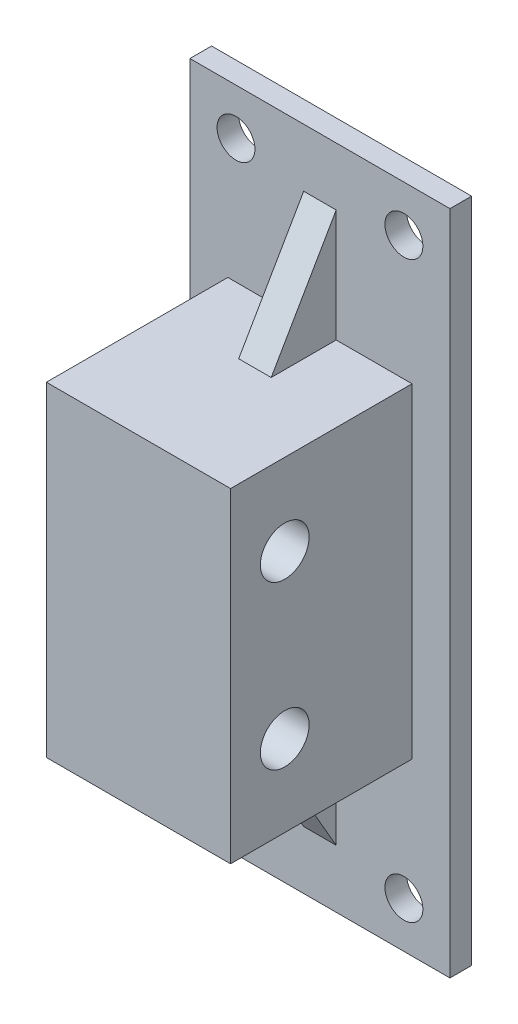
ISO-10303-21;
HEADER;
FILE_DESCRIPTION(('STEP AP214'),'2;1');
FILE_NAME('part.step','',(''),(''),'','','');
FILE_SCHEMA(('AUTOMOTIVE_DESIGN { 1 0 10303 214 1 1 1 1 }'));
ENDSEC;
DATA;
#1=APPLICATION_CONTEXT('core data for automotive mechanical design processes');
#2=APPLICATION_PROTOCOL_DEFINITION('international standard','automotive_design',2000,#1);
#3=PRODUCT_CONTEXT('',#1,'mechanical');
#4=PRODUCT('Part','Part','',(#3));
#5=PRODUCT_RELATED_PRODUCT_CATEGORY('part','',(#4));
#6=PRODUCT_DEFINITION_FORMATION('','',#4);
#7=PRODUCT_DEFINITION_CONTEXT('part definition',#1,'design');
#8=PRODUCT_DEFINITION('design','',#6,#7);
#9=PRODUCT_DEFINITION_SHAPE('','',#8);
#10=(LENGTH_UNIT() NAMED_UNIT(*) SI_UNIT(.MILLI.,.METRE.));
#11=(NAMED_UNIT(*) PLANE_ANGLE_UNIT() SI_UNIT($,.RADIAN.));
#12=(NAMED_UNIT(*) SI_UNIT($,.STERADIAN.) SOLID_ANGLE_UNIT());
#13=UNCERTAINTY_MEASURE_WITH_UNIT(LENGTH_MEASURE(1.E-05),#10,'distance_accuracy_value','');
#14=(GEOMETRIC_REPRESENTATION_CONTEXT(3) GLOBAL_UNCERTAINTY_ASSIGNED_CONTEXT((#13)) GLOBAL_UNIT_ASSIGNED_CONTEXT((#10,
#11,#12)) REPRESENTATION_CONTEXT('',''));
#15=CARTESIAN_POINT('',(0.,0.,0.));
#16=DIRECTION('',(0.,0.,1.));
#17=DIRECTION('',(1.,0.,0.));
#18=AXIS2_PLACEMENT_3D('',#15,#16,#17);
#19=CARTESIAN_POINT('',(0.,0.,2.));
#20=DIRECTION('',(0.,0.,1.));
#21=DIRECTION('',(1.,0.,0.));
#22=AXIS2_PLACEMENT_3D('',#19,#20,#21);
#23=PLANE('',#22);
#24=CARTESIAN_POINT('',(19.75,4.25,2.));
#25=DIRECTION('',(0.,0.,1.));
#26=DIRECTION('',(1.,0.,0.));
#27=AXIS2_PLACEMENT_3D('',#24,#25,#26);
#28=CIRCLE('',#27,1.75);
#29=CARTESIAN_POINT('',(21.5,4.25,2.));
#30=VERTEX_POINT('',#29);
#31=EDGE_CURVE('E471',#30,#30,#28,.T.);
#32=ORIENTED_EDGE('',*,*,#31,.F.);
#33=EDGE_LOOP('',(#32));
#34=FACE_BOUND('',#33,.T.);
#35=CARTESIAN_POINT('',(4.25,4.25,2.));
#36=DIRECTION('',(0.,0.,1.));
#37=DIRECTION('',(1.,0.,0.));
#38=AXIS2_PLACEMENT_3D('',#35,#36,#37);
#39=CIRCLE('',#38,1.75);
#40=CARTESIAN_POINT('',(6.,4.25,2.));
#41=VERTEX_POINT('',#40);
#42=EDGE_CURVE('E473',#41,#41,#39,.T.);
#43=ORIENTED_EDGE('',*,*,#42,.F.);
#44=EDGE_LOOP('',(#43));
#45=FACE_BOUND('',#44,.T.);
#46=CARTESIAN_POINT('',(19.75,57.2499999999997,2.));
#47=DIRECTION('',(0.,0.,1.));
#48=DIRECTION('',(1.,0.,0.));
#49=AXIS2_PLACEMENT_3D('',#46,#47,#48);
#50=CIRCLE('',#49,1.75);
#51=CARTESIAN_POINT('',(21.5,57.2499999999997,2.));
#52=VERTEX_POINT('',#51);
#53=EDGE_CURVE('E479',#52,#52,#50,.T.);
#54=ORIENTED_EDGE('',*,*,#53,.F.);
#55=EDGE_LOOP('',(#54));
#56=FACE_BOUND('',#55,.T.);
#57=CARTESIAN_POINT('',(4.25,57.2499999999997,2.));
#58=DIRECTION('',(0.,0.,1.));
#59=DIRECTION('',(1.,0.,0.));
#60=AXIS2_PLACEMENT_3D('',#57,#58,#59);
#61=CIRCLE('',#60,1.75);
#62=CARTESIAN_POINT('',(6.,57.2499999999997,2.));
#63=VERTEX_POINT('',#62);
#64=EDGE_CURVE('E485',#63,#63,#61,.T.);
#65=ORIENTED_EDGE('',*,*,#64,.F.);
#66=EDGE_LOOP('',(#65));
#67=FACE_BOUND('',#66,.T.);
#68=DIRECTION('',(0.,-1.,0.));
#69=VECTOR('',#68,1.);
#70=CARTESIAN_POINT('',(0.,61.4999999999997,2.));
#71=LINE('',#70,#69);
#72=CARTESIAN_POINT('',(0.,61.4999999999997,2.));
#73=VERTEX_POINT('',#72);
#74=CARTESIAN_POINT('',(0.,0.,2.));
#75=VERTEX_POINT('',#74);
#76=EDGE_CURVE('E218',#73,#75,#71,.T.);
#77=ORIENTED_EDGE('',*,*,#76,.T.);
#78=DIRECTION('',(1.,0.,0.));
#79=VECTOR('',#78,1.);
#80=CARTESIAN_POINT('',(0.,0.,2.));
#81=LINE('',#80,#79);
#82=CARTESIAN_POINT('',(24.,0.,2.));
#83=VERTEX_POINT('',#82);
#84=EDGE_CURVE('E221',#75,#83,#81,.T.);
#85=ORIENTED_EDGE('',*,*,#84,.T.);
#86=DIRECTION('',(0.,1.,0.));
#87=VECTOR('',#86,1.);
#88=CARTESIAN_POINT('',(24.,61.4999999999997,2.));
#89=LINE('',#88,#87);
#90=CARTESIAN_POINT('',(24.,61.4999999999997,2.));
#91=VERTEX_POINT('',#90);
#92=EDGE_CURVE('E224',#83,#91,#89,.T.);
#93=ORIENTED_EDGE('',*,*,#92,.T.);
#94=DIRECTION('',(-1.,0.,0.));
#95=VECTOR('',#94,1.);
#96=CARTESIAN_POINT('',(0.,61.4999999999997,2.));
#97=LINE('',#96,#95);
#98=EDGE_CURVE('E226',#91,#73,#97,.T.);
#99=ORIENTED_EDGE('',*,*,#98,.T.);
#100=EDGE_LOOP('',(#77,#85,#93,#99));
#101=FACE_BOUND('',#100,.T.);
#102=DIRECTION('',(1.,0.,0.));
#103=VECTOR('',#102,1.);
#104=CARTESIAN_POINT('',(3.5,15.7500000000002,2.));
#105=LINE('',#104,#103);
#106=CARTESIAN_POINT('',(13.5,15.7500000000001,2.));
#107=VERTEX_POINT('',#106);
#108=CARTESIAN_POINT('',(20.5,15.7500000000002,2.));
#109=VERTEX_POINT('',#108);
#110=EDGE_CURVE('E199',#107,#109,#105,.T.);
#111=ORIENTED_EDGE('',*,*,#110,.F.);
#112=DIRECTION('',(0.,1.,0.));
#113=VECTOR('',#112,1.);
#114=CARTESIAN_POINT('',(13.5,15.7500000000001,2.));
#115=LINE('',#114,#113);
#116=CARTESIAN_POINT('',(13.5,5.357695154587,2.));
#117=VERTEX_POINT('',#116);
#118=EDGE_CURVE('E143',#117,#107,#115,.T.);
#119=ORIENTED_EDGE('',*,*,#118,.F.);
#120=DIRECTION('',(-1.,0.,0.));
#121=VECTOR('',#120,1.);
#122=CARTESIAN_POINT('',(13.5,5.357695154587,2.));
#123=LINE('',#122,#121);
#124=CARTESIAN_POINT('',(10.5,5.357695154587,2.));
#125=VERTEX_POINT('',#124);
#126=EDGE_CURVE('E140',#117,#125,#123,.T.);
#127=ORIENTED_EDGE('',*,*,#126,.T.);
#128=DIRECTION('',(0.,1.,0.));
#129=VECTOR('',#128,1.);
#130=CARTESIAN_POINT('',(10.5,15.7500000000001,2.));
#131=LINE('',#130,#129);
#132=CARTESIAN_POINT('',(10.5,15.7500000000001,2.));
#133=VERTEX_POINT('',#132);
#134=EDGE_CURVE('E150',#125,#133,#131,.T.);
#135=ORIENTED_EDGE('',*,*,#134,.T.);
#136=CARTESIAN_POINT('',(3.5,15.7500000000002,2.));
#137=VERTEX_POINT('',#136);
#138=EDGE_CURVE('E200',#137,#133,#105,.T.);
#139=ORIENTED_EDGE('',*,*,#138,.F.);
#140=DIRECTION('',(0.,-1.,0.));
#141=VECTOR('',#140,1.);
#142=CARTESIAN_POINT('',(3.5,45.75,2.));
#143=LINE('',#142,#141);
#144=CARTESIAN_POINT('',(3.5,45.75,2.));
#145=VERTEX_POINT('',#144);
#146=EDGE_CURVE('E185',#145,#137,#143,.T.);
#147=ORIENTED_EDGE('',*,*,#146,.F.);
#148=DIRECTION('',(-1.,0.,0.));
#149=VECTOR('',#148,1.);
#150=CARTESIAN_POINT('',(3.5,45.75,2.));
#151=LINE('',#150,#149);
#152=CARTESIAN_POINT('',(10.5,45.75,2.));
#153=VERTEX_POINT('',#152);
#154=EDGE_CURVE('E205',#153,#145,#151,.T.);
#155=ORIENTED_EDGE('',*,*,#154,.F.);
#156=DIRECTION('',(0.,1.,0.));
#157=VECTOR('',#156,1.);
#158=CARTESIAN_POINT('',(10.5,56.1423048454131,2.));
#159=LINE('',#158,#157);
#160=CARTESIAN_POINT('',(10.5,56.1423048454131,2.));
#161=VERTEX_POINT('',#160);
#162=EDGE_CURVE('E168',#153,#161,#159,.T.);
#163=ORIENTED_EDGE('',*,*,#162,.T.);
#164=DIRECTION('',(-1.,0.,0.));
#165=VECTOR('',#164,1.);
#166=CARTESIAN_POINT('',(13.5,56.1423048454131,2.));
#167=LINE('',#166,#165);
#168=CARTESIAN_POINT('',(13.5,56.1423048454131,2.));
#169=VERTEX_POINT('',#168);
#170=EDGE_CURVE('E60',#169,#161,#167,.T.);
#171=ORIENTED_EDGE('',*,*,#170,.F.);
#172=DIRECTION('',(0.,1.,0.));
#173=VECTOR('',#172,1.);
#174=CARTESIAN_POINT('',(13.5,56.1423048454131,2.));
#175=LINE('',#174,#173);
#176=CARTESIAN_POINT('',(13.5,45.75,2.));
#177=VERTEX_POINT('',#176);
#178=EDGE_CURVE('E171',#177,#169,#175,.T.);
#179=ORIENTED_EDGE('',*,*,#178,.F.);
#180=CARTESIAN_POINT('',(20.5,45.75,2.));
#181=VERTEX_POINT('',#180);
#182=EDGE_CURVE('E190',#181,#177,#151,.T.);
#183=ORIENTED_EDGE('',*,*,#182,.F.);
#184=DIRECTION('',(0.,1.,0.));
#185=VECTOR('',#184,1.);
#186=CARTESIAN_POINT('',(20.5,45.75,2.));
#187=LINE('',#186,#185);
#188=EDGE_CURVE('E202',#109,#181,#187,.T.);
#189=ORIENTED_EDGE('',*,*,#188,.F.);
#190=EDGE_LOOP('',(#111,#119,#127,#135,#139,#147,#155,#163,#171,#179,#183,#189));
#191=FACE_BOUND('',#190,.T.);
#192=ADVANCED_FACE('F35',(#34,#45,#56,#67,#101,#191),#23,.T.);
#193=CARTESIAN_POINT('',(3.5,15.7500000000002,18.75));
#194=DIRECTION('',(0.,1.,0.));
#195=DIRECTION('',(0.,0.,1.));
#196=AXIS2_PLACEMENT_3D('',#193,#194,#195);
#197=PLANE('',#196);
#198=DIRECTION('',(0.,0.,1.));
#199=VECTOR('',#198,1.);
#200=CARTESIAN_POINT('',(13.5,15.7500000000001,8.));
#201=LINE('',#200,#199);
#202=CARTESIAN_POINT('',(13.5,15.7500000000001,8.));
#203=VERTEX_POINT('',#202);
#204=EDGE_CURVE('E144',#107,#203,#201,.T.);
#205=ORIENTED_EDGE('',*,*,#204,.F.);
#206=ORIENTED_EDGE('',*,*,#110,.T.);
#207=DIRECTION('',(0.,0.,-1.));
#208=VECTOR('',#207,1.);
#209=CARTESIAN_POINT('',(20.5,15.7500000000002,18.75));
#210=LINE('',#209,#208);
#211=CARTESIAN_POINT('',(20.5,15.7500000000002,18.75));
#212=VERTEX_POINT('',#211);
#213=EDGE_CURVE('E212',#212,#109,#210,.T.);
#214=ORIENTED_EDGE('',*,*,#213,.F.);
#215=DIRECTION('',(1.,0.,0.));
#216=VECTOR('',#215,1.);
#217=CARTESIAN_POINT('',(3.5,15.7500000000002,18.75));
#218=LINE('',#217,#216);
#219=CARTESIAN_POINT('',(3.5,15.7500000000002,18.75));
#220=VERTEX_POINT('',#219);
#221=EDGE_CURVE('E189',#220,#212,#218,.T.);
#222=ORIENTED_EDGE('',*,*,#221,.F.);
#223=DIRECTION('',(0.,0.,-1.));
#224=VECTOR('',#223,1.);
#225=CARTESIAN_POINT('',(3.5,15.7500000000002,18.75));
#226=LINE('',#225,#224);
#227=EDGE_CURVE('E215',#220,#137,#226,.T.);
#228=ORIENTED_EDGE('',*,*,#227,.T.);
#229=ORIENTED_EDGE('',*,*,#138,.T.);
#230=DIRECTION('',(0.,0.,1.));
#231=VECTOR('',#230,1.);
#232=CARTESIAN_POINT('',(10.5,15.7500000000001,8.));
#233=LINE('',#232,#231);
#234=CARTESIAN_POINT('',(10.5,15.7500000000002,8.));
#235=VERTEX_POINT('',#234);
#236=EDGE_CURVE('E155',#133,#235,#233,.T.);
#237=ORIENTED_EDGE('',*,*,#236,.T.);
#238=DIRECTION('',(-1.,0.,0.));
#239=VECTOR('',#238,1.);
#240=CARTESIAN_POINT('',(13.5,15.7500000000001,8.));
#241=LINE('',#240,#239);
#242=EDGE_CURVE('E52',#203,#235,#241,.T.);
#243=ORIENTED_EDGE('',*,*,#242,.F.);
#244=EDGE_LOOP('',(#205,#206,#214,#222,#228,#229,#237,#243));
#245=FACE_BOUND('',#244,.T.);
#246=ADVANCED_FACE('F153',(#245),#197,.F.);
#247=CARTESIAN_POINT('',(0.,0.,0.));
#248=DIRECTION('',(0.,0.,1.));
#249=DIRECTION('',(1.,0.,0.));
#250=AXIS2_PLACEMENT_3D('',#247,#248,#249);
#251=PLANE('',#250);
#252=CARTESIAN_POINT('',(19.75,4.25,0.));
#253=DIRECTION('',(0.,0.,1.));
#254=DIRECTION('',(1.,0.,0.));
#255=AXIS2_PLACEMENT_3D('',#252,#253,#254);
#256=CIRCLE('',#255,1.75);
#257=CARTESIAN_POINT('',(21.5,4.25,0.));
#258=VERTEX_POINT('',#257);
#259=EDGE_CURVE('E469',#258,#258,#256,.T.);
#260=ORIENTED_EDGE('',*,*,#259,.T.);
#261=EDGE_LOOP('',(#260));
#262=FACE_BOUND('',#261,.T.);
#263=CARTESIAN_POINT('',(4.25,4.25,0.));
#264=DIRECTION('',(0.,0.,1.));
#265=DIRECTION('',(1.,0.,0.));
#266=AXIS2_PLACEMENT_3D('',#263,#264,#265);
#267=CIRCLE('',#266,1.75);
#268=CARTESIAN_POINT('',(6.,4.25,0.));
#269=VERTEX_POINT('',#268);
#270=EDGE_CURVE('E476',#269,#269,#267,.T.);
#271=ORIENTED_EDGE('',*,*,#270,.T.);
#272=EDGE_LOOP('',(#271));
#273=FACE_BOUND('',#272,.T.);
#274=CARTESIAN_POINT('',(19.75,57.2499999999997,0.));
#275=DIRECTION('',(0.,0.,1.));
#276=DIRECTION('',(1.,0.,0.));
#277=AXIS2_PLACEMENT_3D('',#274,#275,#276);
#278=CIRCLE('',#277,1.75);
#279=CARTESIAN_POINT('',(21.5,57.2499999999997,0.));
#280=VERTEX_POINT('',#279);
#281=EDGE_CURVE('E482',#280,#280,#278,.T.);
#282=ORIENTED_EDGE('',*,*,#281,.T.);
#283=EDGE_LOOP('',(#282));
#284=FACE_BOUND('',#283,.T.);
#285=CARTESIAN_POINT('',(4.25,57.2499999999997,0.));
#286=DIRECTION('',(0.,0.,1.));
#287=DIRECTION('',(1.,0.,0.));
#288=AXIS2_PLACEMENT_3D('',#285,#286,#287);
#289=CIRCLE('',#288,1.75);
#290=CARTESIAN_POINT('',(6.,57.2499999999997,0.));
#291=VERTEX_POINT('',#290);
#292=EDGE_CURVE('E294',#291,#291,#289,.T.);
#293=ORIENTED_EDGE('',*,*,#292,.T.);
#294=EDGE_LOOP('',(#293));
#295=FACE_BOUND('',#294,.T.);
#296=DIRECTION('',(0.,-1.,0.));
#297=VECTOR('',#296,1.);
#298=CARTESIAN_POINT('',(0.,61.4999999999997,0.));
#299=LINE('',#298,#297);
#300=CARTESIAN_POINT('',(0.,61.4999999999997,0.));
#301=VERTEX_POINT('',#300);
#302=CARTESIAN_POINT('',(0.,0.,0.));
#303=VERTEX_POINT('',#302);
#304=EDGE_CURVE('E217',#301,#303,#299,.T.);
#305=ORIENTED_EDGE('',*,*,#304,.F.);
#306=DIRECTION('',(-1.,0.,0.));
#307=VECTOR('',#306,1.);
#308=CARTESIAN_POINT('',(0.,61.4999999999997,0.));
#309=LINE('',#308,#307);
#310=CARTESIAN_POINT('',(24.,61.4999999999997,0.));
#311=VERTEX_POINT('',#310);
#312=EDGE_CURVE('E222',#311,#301,#309,.T.);
#313=ORIENTED_EDGE('',*,*,#312,.F.);
#314=DIRECTION('',(0.,1.,0.));
#315=VECTOR('',#314,1.);
#316=CARTESIAN_POINT('',(24.,61.4999999999997,0.));
#317=LINE('',#316,#315);
#318=CARTESIAN_POINT('',(24.,0.,0.));
#319=VERTEX_POINT('',#318);
#320=EDGE_CURVE('E233',#319,#311,#317,.T.);
#321=ORIENTED_EDGE('',*,*,#320,.F.);
#322=DIRECTION('',(1.,0.,0.));
#323=VECTOR('',#322,1.);
#324=CARTESIAN_POINT('',(0.,0.,0.));
#325=LINE('',#324,#323);
#326=EDGE_CURVE('E231',#303,#319,#325,.T.);
#327=ORIENTED_EDGE('',*,*,#326,.F.);
#328=EDGE_LOOP('',(#305,#313,#321,#327));
#329=FACE_BOUND('',#328,.T.);
#330=ADVANCED_FACE('F316',(#262,#273,#284,#295,#329),#251,.F.);
#331=CARTESIAN_POINT('',(0.,61.4999999999997,2.));
#332=DIRECTION('',(1.,0.,0.));
#333=DIRECTION('',(0.,0.,-1.));
#334=AXIS2_PLACEMENT_3D('',#331,#332,#333);
#335=PLANE('',#334);
#336=ORIENTED_EDGE('',*,*,#304,.T.);
#337=DIRECTION('',(0.,0.,-1.));
#338=VECTOR('',#337,1.);
#339=CARTESIAN_POINT('',(0.,0.,2.));
#340=LINE('',#339,#338);
#341=EDGE_CURVE('E11',#75,#303,#340,.T.);
#342=ORIENTED_EDGE('',*,*,#341,.F.);
#343=ORIENTED_EDGE('',*,*,#76,.F.);
#344=DIRECTION('',(0.,0.,-1.));
#345=VECTOR('',#344,1.);
#346=CARTESIAN_POINT('',(0.,61.4999999999997,2.));
#347=LINE('',#346,#345);
#348=EDGE_CURVE('E228',#73,#301,#347,.T.);
#349=ORIENTED_EDGE('',*,*,#348,.T.);
#350=EDGE_LOOP('',(#336,#342,#343,#349));
#351=FACE_BOUND('',#350,.T.);
#352=ADVANCED_FACE('F37',(#351),#335,.F.);
#353=CARTESIAN_POINT('',(0.,0.,2.));
#354=DIRECTION('',(0.,1.,0.));
#355=DIRECTION('',(0.,0.,1.));
#356=AXIS2_PLACEMENT_3D('',#353,#354,#355);
#357=PLANE('',#356);
#358=ORIENTED_EDGE('',*,*,#326,.T.);
#359=DIRECTION('',(0.,0.,-1.));
#360=VECTOR('',#359,1.);
#361=CARTESIAN_POINT('',(24.,0.,2.));
#362=LINE('',#361,#360);
#363=EDGE_CURVE('E44',#83,#319,#362,.T.);
#364=ORIENTED_EDGE('',*,*,#363,.F.);
#365=ORIENTED_EDGE('',*,*,#84,.F.);
#366=ORIENTED_EDGE('',*,*,#341,.T.);
#367=EDGE_LOOP('',(#358,#364,#365,#366));
#368=FACE_BOUND('',#367,.T.);
#369=ADVANCED_FACE('F328',(#368),#357,.F.);
#370=CARTESIAN_POINT('',(24.,61.4999999999997,2.));
#371=DIRECTION('',(-1.,0.,0.));
#372=DIRECTION('',(0.,0.,1.));
#373=AXIS2_PLACEMENT_3D('',#370,#371,#372);
#374=PLANE('',#373);
#375=ORIENTED_EDGE('',*,*,#320,.T.);
#376=DIRECTION('',(0.,0.,-1.));
#377=VECTOR('',#376,1.);
#378=CARTESIAN_POINT('',(24.,61.4999999999997,2.));
#379=LINE('',#378,#377);
#380=EDGE_CURVE('E238',#91,#311,#379,.T.);
#381=ORIENTED_EDGE('',*,*,#380,.F.);
#382=ORIENTED_EDGE('',*,*,#92,.F.);
#383=ORIENTED_EDGE('',*,*,#363,.T.);
#384=EDGE_LOOP('',(#375,#381,#382,#383));
#385=FACE_BOUND('',#384,.T.);
#386=ADVANCED_FACE('F325',(#385),#374,.F.);
#387=CARTESIAN_POINT('',(0.,61.4999999999997,2.));
#388=DIRECTION('',(0.,-1.,0.));
#389=DIRECTION('',(0.,0.,-1.));
#390=AXIS2_PLACEMENT_3D('',#387,#388,#389);
#391=PLANE('',#390);
#392=ORIENTED_EDGE('',*,*,#312,.T.);
#393=ORIENTED_EDGE('',*,*,#348,.F.);
#394=ORIENTED_EDGE('',*,*,#98,.F.);
#395=ORIENTED_EDGE('',*,*,#380,.T.);
#396=EDGE_LOOP('',(#392,#393,#394,#395));
#397=FACE_BOUND('',#396,.T.);
#398=ADVANCED_FACE('F259',(#397),#391,.F.);
#399=CARTESIAN_POINT('',(3.5,45.75,18.75));
#400=DIRECTION('',(1.,0.,0.));
#401=DIRECTION('',(0.,1.,0.));
#402=AXIS2_PLACEMENT_3D('',#399,#400,#401);
#403=PLANE('',#402);
#404=CARTESIAN_POINT('',(3.5,38.25,13.75));
#405=DIRECTION('',(1.,0.,0.));
#406=DIRECTION('',(0.,1.,0.));
#407=AXIS2_PLACEMENT_3D('',#404,#405,#406);
#408=CIRCLE('',#407,2.25);
#409=CARTESIAN_POINT('',(3.5,40.5,13.75));
#410=VERTEX_POINT('',#409);
#411=EDGE_CURVE('E178',#410,#410,#408,.T.);
#412=ORIENTED_EDGE('',*,*,#411,.T.);
#413=EDGE_LOOP('',(#412));
#414=FACE_BOUND('',#413,.T.);
#415=CARTESIAN_POINT('',(3.5,23.2500000000002,13.75));
#416=DIRECTION('',(1.,0.,0.));
#417=DIRECTION('',(0.,1.,0.));
#418=AXIS2_PLACEMENT_3D('',#415,#416,#417);
#419=CIRCLE('',#418,2.25);
#420=CARTESIAN_POINT('',(3.5,25.5000000000002,13.75));
#421=VERTEX_POINT('',#420);
#422=EDGE_CURVE('E182',#421,#421,#419,.T.);
#423=ORIENTED_EDGE('',*,*,#422,.T.);
#424=EDGE_LOOP('',(#423));
#425=FACE_BOUND('',#424,.T.);
#426=ORIENTED_EDGE('',*,*,#146,.T.);
#427=ORIENTED_EDGE('',*,*,#227,.F.);
#428=DIRECTION('',(0.,-1.,0.));
#429=VECTOR('',#428,1.);
#430=CARTESIAN_POINT('',(3.5,45.75,18.75));
#431=LINE('',#430,#429);
#432=CARTESIAN_POINT('',(3.5,45.75,18.75));
#433=VERTEX_POINT('',#432);
#434=EDGE_CURVE('E186',#433,#220,#431,.T.);
#435=ORIENTED_EDGE('',*,*,#434,.F.);
#436=DIRECTION('',(0.,0.,-1.));
#437=VECTOR('',#436,1.);
#438=CARTESIAN_POINT('',(3.5,45.75,18.75));
#439=LINE('',#438,#437);
#440=EDGE_CURVE('E196',#433,#145,#439,.T.);
#441=ORIENTED_EDGE('',*,*,#440,.T.);
#442=EDGE_LOOP('',(#426,#427,#435,#441));
#443=FACE_BOUND('',#442,.T.);
#444=ADVANCED_FACE('F256',(#414,#425,#443),#403,.F.);
#445=CARTESIAN_POINT('',(20.5,45.75,18.75));
#446=DIRECTION('',(-1.,0.,0.));
#447=DIRECTION('',(0.,-1.,0.));
#448=AXIS2_PLACEMENT_3D('',#445,#446,#447);
#449=PLANE('',#448);
#450=CARTESIAN_POINT('',(20.5,38.25,13.75));
#451=DIRECTION('',(-1.,0.,0.));
#452=DIRECTION('',(0.,-1.,0.));
#453=AXIS2_PLACEMENT_3D('',#450,#451,#452);
#454=CIRCLE('',#453,2.25);
#455=CARTESIAN_POINT('',(20.5,36.,13.75));
#456=VERTEX_POINT('',#455);
#457=EDGE_CURVE('E39',#456,#456,#454,.T.);
#458=ORIENTED_EDGE('',*,*,#457,.T.);
#459=EDGE_LOOP('',(#458));
#460=FACE_BOUND('',#459,.T.);
#461=CARTESIAN_POINT('',(20.5,23.2500000000002,13.75));
#462=DIRECTION('',(-1.,0.,0.));
#463=DIRECTION('',(0.,-1.,0.));
#464=AXIS2_PLACEMENT_3D('',#461,#462,#463);
#465=CIRCLE('',#464,2.25);
#466=CARTESIAN_POINT('',(20.5,21.0000000000001,13.75));
#467=VERTEX_POINT('',#466);
#468=EDGE_CURVE('E181',#467,#467,#465,.T.);
#469=ORIENTED_EDGE('',*,*,#468,.T.);
#470=EDGE_LOOP('',(#469));
#471=FACE_BOUND('',#470,.T.);
#472=ORIENTED_EDGE('',*,*,#188,.T.);
#473=DIRECTION('',(0.,0.,-1.));
#474=VECTOR('',#473,1.);
#475=CARTESIAN_POINT('',(20.5,45.75,18.75));
#476=LINE('',#475,#474);
#477=CARTESIAN_POINT('',(20.5,45.75,18.75));
#478=VERTEX_POINT('',#477);
#479=EDGE_CURVE('E210',#478,#181,#476,.T.);
#480=ORIENTED_EDGE('',*,*,#479,.F.);
#481=DIRECTION('',(0.,1.,0.));
#482=VECTOR('',#481,1.);
#483=CARTESIAN_POINT('',(20.5,45.75,18.75));
#484=LINE('',#483,#482);
#485=EDGE_CURVE('E192',#212,#478,#484,.T.);
#486=ORIENTED_EDGE('',*,*,#485,.F.);
#487=ORIENTED_EDGE('',*,*,#213,.T.);
#488=EDGE_LOOP('',(#472,#480,#486,#487));
#489=FACE_BOUND('',#488,.T.);
#490=ADVANCED_FACE('F245',(#460,#471,#489),#449,.F.);
#491=CARTESIAN_POINT('',(3.5,45.75,18.75));
#492=DIRECTION('',(0.,-1.,0.));
#493=DIRECTION('',(0.,0.,-1.));
#494=AXIS2_PLACEMENT_3D('',#491,#492,#493);
#495=PLANE('',#494);
#496=ORIENTED_EDGE('',*,*,#182,.T.);
#497=DIRECTION('',(0.,0.,-1.));
#498=VECTOR('',#497,1.);
#499=CARTESIAN_POINT('',(13.5,45.75,2.));
#500=LINE('',#499,#498);
#501=CARTESIAN_POINT('',(13.5,45.75,8.));
#502=VERTEX_POINT('',#501);
#503=EDGE_CURVE('E167',#502,#177,#500,.T.);
#504=ORIENTED_EDGE('',*,*,#503,.F.);
#505=DIRECTION('',(-1.,0.,0.));
#506=VECTOR('',#505,1.);
#507=CARTESIAN_POINT('',(13.5,45.75,8.));
#508=LINE('',#507,#506);
#509=CARTESIAN_POINT('',(10.5,45.75,8.));
#510=VERTEX_POINT('',#509);
#511=EDGE_CURVE('E176',#502,#510,#508,.T.);
#512=ORIENTED_EDGE('',*,*,#511,.T.);
#513=DIRECTION('',(0.,0.,-1.));
#514=VECTOR('',#513,1.);
#515=CARTESIAN_POINT('',(10.5,45.75,2.));
#516=LINE('',#515,#514);
#517=EDGE_CURVE('E159',#510,#153,#516,.T.);
#518=ORIENTED_EDGE('',*,*,#517,.T.);
#519=ORIENTED_EDGE('',*,*,#154,.T.);
#520=ORIENTED_EDGE('',*,*,#440,.F.);
#521=DIRECTION('',(-1.,0.,0.));
#522=VECTOR('',#521,1.);
#523=CARTESIAN_POINT('',(3.5,45.75,18.75));
#524=LINE('',#523,#522);
#525=EDGE_CURVE('E194',#478,#433,#524,.T.);
#526=ORIENTED_EDGE('',*,*,#525,.F.);
#527=ORIENTED_EDGE('',*,*,#479,.T.);
#528=EDGE_LOOP('',(#496,#504,#512,#518,#519,#520,#526,#527));
#529=FACE_BOUND('',#528,.T.);
#530=ADVANCED_FACE('F276',(#529),#495,.F.);
#531=CARTESIAN_POINT('',(0.,0.,18.75));
#532=DIRECTION('',(0.,0.,1.));
#533=DIRECTION('',(1.,0.,0.));
#534=AXIS2_PLACEMENT_3D('',#531,#532,#533);
#535=PLANE('',#534);
#536=ORIENTED_EDGE('',*,*,#434,.T.);
#537=ORIENTED_EDGE('',*,*,#221,.T.);
#538=ORIENTED_EDGE('',*,*,#485,.T.);
#539=ORIENTED_EDGE('',*,*,#525,.T.);
#540=EDGE_LOOP('',(#536,#537,#538,#539));
#541=FACE_BOUND('',#540,.T.);
#542=ADVANCED_FACE('F252',(#541),#535,.T.);
#543=CARTESIAN_POINT('',(0.,23.2500000000002,13.75));
#544=DIRECTION('',(1.,0.,0.));
#545=DIRECTION('',(0.,0.,-1.));
#546=AXIS2_PLACEMENT_3D('',#543,#544,#545);
#547=CYLINDRICAL_SURFACE('',#546,2.25);
#548=ORIENTED_EDGE('',*,*,#468,.F.);
#549=EDGE_LOOP('',(#548));
#550=FACE_BOUND('',#549,.T.);
#551=ORIENTED_EDGE('',*,*,#422,.F.);
#552=EDGE_LOOP('',(#551));
#553=FACE_BOUND('',#552,.T.);
#554=ADVANCED_FACE('F248',(#550,#553),#547,.F.);
#555=CARTESIAN_POINT('',(0.,38.25,13.75));
#556=DIRECTION('',(1.,0.,0.));
#557=DIRECTION('',(0.,0.,-1.));
#558=AXIS2_PLACEMENT_3D('',#555,#556,#557);
#559=CYLINDRICAL_SURFACE('',#558,2.25);
#560=ORIENTED_EDGE('',*,*,#457,.F.);
#561=EDGE_LOOP('',(#560));
#562=FACE_BOUND('',#561,.T.);
#563=ORIENTED_EDGE('',*,*,#411,.F.);
#564=EDGE_LOOP('',(#563));
#565=FACE_BOUND('',#564,.T.);
#566=ADVANCED_FACE('F251',(#562,#565),#559,.F.);
#567=CARTESIAN_POINT('',(13.5,45.75,8.));
#568=DIRECTION('',(0.,-0.500000000000004,-0.866025403784436));
#569=DIRECTION('',(0.,0.866025403784436,-0.500000000000004));
#570=AXIS2_PLACEMENT_3D('',#567,#568,#569);
#571=PLANE('',#570);
#572=DIRECTION('',(0.,-0.866025403784436,0.500000000000004));
#573=VECTOR('',#572,1.);
#574=CARTESIAN_POINT('',(10.5,45.75,8.));
#575=LINE('',#574,#573);
#576=EDGE_CURVE('E156',#161,#510,#575,.T.);
#577=ORIENTED_EDGE('',*,*,#576,.T.);
#578=ORIENTED_EDGE('',*,*,#511,.F.);
#579=DIRECTION('',(0.,-0.866025403784436,0.500000000000004));
#580=VECTOR('',#579,1.);
#581=CARTESIAN_POINT('',(13.5,45.75,8.));
#582=LINE('',#581,#580);
#583=EDGE_CURVE('E164',#169,#502,#582,.T.);
#584=ORIENTED_EDGE('',*,*,#583,.F.);
#585=ORIENTED_EDGE('',*,*,#170,.T.);
#586=EDGE_LOOP('',(#577,#578,#584,#585));
#587=FACE_BOUND('',#586,.T.);
#588=ADVANCED_FACE('F284',(#587),#571,.F.);
#589=CARTESIAN_POINT('',(13.5,0.,0.));
#590=DIRECTION('',(1.,0.,0.));
#591=DIRECTION('',(0.,1.,0.));
#592=AXIS2_PLACEMENT_3D('',#589,#590,#591);
#593=PLANE('',#592);
#594=ORIENTED_EDGE('',*,*,#583,.T.);
#595=ORIENTED_EDGE('',*,*,#503,.T.);
#596=ORIENTED_EDGE('',*,*,#178,.T.);
#597=EDGE_LOOP('',(#594,#595,#596));
#598=FACE_BOUND('',#597,.T.);
#599=ADVANCED_FACE('F287',(#598),#593,.T.);
#600=CARTESIAN_POINT('',(10.5,0.,0.));
#601=DIRECTION('',(1.,0.,0.));
#602=DIRECTION('',(0.,1.,0.));
#603=AXIS2_PLACEMENT_3D('',#600,#601,#602);
#604=PLANE('',#603);
#605=ORIENTED_EDGE('',*,*,#576,.F.);
#606=ORIENTED_EDGE('',*,*,#162,.F.);
#607=ORIENTED_EDGE('',*,*,#517,.F.);
#608=EDGE_LOOP('',(#605,#606,#607));
#609=FACE_BOUND('',#608,.T.);
#610=ADVANCED_FACE('F281',(#609),#604,.F.);
#611=CARTESIAN_POINT('',(13.5,5.357695154587,2.));
#612=DIRECTION('',(0.,0.500000000000004,-0.866025403784436));
#613=DIRECTION('',(0.,0.866025403784436,0.500000000000004));
#614=AXIS2_PLACEMENT_3D('',#611,#612,#613);
#615=PLANE('',#614);
#616=DIRECTION('',(0.,-0.866025403784436,-0.500000000000004));
#617=VECTOR('',#616,1.);
#618=CARTESIAN_POINT('',(10.5,5.357695154587,2.));
#619=LINE('',#618,#617);
#620=EDGE_CURVE('E293',#235,#125,#619,.T.);
#621=ORIENTED_EDGE('',*,*,#620,.T.);
#622=ORIENTED_EDGE('',*,*,#126,.F.);
#623=DIRECTION('',(0.,-0.866025403784436,-0.500000000000004));
#624=VECTOR('',#623,1.);
#625=CARTESIAN_POINT('',(13.5,5.357695154587,2.));
#626=LINE('',#625,#624);
#627=EDGE_CURVE('E136',#203,#117,#626,.T.);
#628=ORIENTED_EDGE('',*,*,#627,.F.);
#629=ORIENTED_EDGE('',*,*,#242,.T.);
#630=EDGE_LOOP('',(#621,#622,#628,#629));
#631=FACE_BOUND('',#630,.T.);
#632=ADVANCED_FACE('F138',(#631),#615,.F.);
#633=CARTESIAN_POINT('',(13.5,0.,0.));
#634=DIRECTION('',(-1.,0.,0.));
#635=DIRECTION('',(0.,-1.,0.));
#636=AXIS2_PLACEMENT_3D('',#633,#634,#635);
#637=PLANE('',#636);
#638=ORIENTED_EDGE('',*,*,#204,.T.);
#639=ORIENTED_EDGE('',*,*,#627,.T.);
#640=ORIENTED_EDGE('',*,*,#118,.T.);
#641=EDGE_LOOP('',(#638,#639,#640));
#642=FACE_BOUND('',#641,.T.);
#643=ADVANCED_FACE('F147',(#642),#637,.F.);
#644=CARTESIAN_POINT('',(10.5,0.,0.));
#645=DIRECTION('',(-1.,0.,0.));
#646=DIRECTION('',(0.,-1.,0.));
#647=AXIS2_PLACEMENT_3D('',#644,#645,#646);
#648=PLANE('',#647);
#649=ORIENTED_EDGE('',*,*,#236,.F.);
#650=ORIENTED_EDGE('',*,*,#134,.F.);
#651=ORIENTED_EDGE('',*,*,#620,.F.);
#652=EDGE_LOOP('',(#649,#650,#651));
#653=FACE_BOUND('',#652,.T.);
#654=ADVANCED_FACE('F296',(#653),#648,.T.);
#655=CARTESIAN_POINT('',(4.25,57.2499999999997,0.));
#656=DIRECTION('',(0.,0.,1.));
#657=DIRECTION('',(1.,0.,0.));
#658=AXIS2_PLACEMENT_3D('',#655,#656,#657);
#659=CYLINDRICAL_SURFACE('',#658,1.75);
#660=ORIENTED_EDGE('',*,*,#292,.F.);
#661=EDGE_LOOP('',(#660));
#662=FACE_BOUND('',#661,.T.);
#663=ORIENTED_EDGE('',*,*,#64,.T.);
#664=EDGE_LOOP('',(#663));
#665=FACE_BOUND('',#664,.T.);
#666=ADVANCED_FACE('F298',(#662,#665),#659,.F.);
#667=CARTESIAN_POINT('',(19.75,57.2499999999997,0.));
#668=DIRECTION('',(0.,0.,1.));
#669=DIRECTION('',(1.,0.,0.));
#670=AXIS2_PLACEMENT_3D('',#667,#668,#669);
#671=CYLINDRICAL_SURFACE('',#670,1.75);
#672=ORIENTED_EDGE('',*,*,#281,.F.);
#673=EDGE_LOOP('',(#672));
#674=FACE_BOUND('',#673,.T.);
#675=ORIENTED_EDGE('',*,*,#53,.T.);
#676=EDGE_LOOP('',(#675));
#677=FACE_BOUND('',#676,.T.);
#678=ADVANCED_FACE('F305',(#674,#677),#671,.F.);
#679=CARTESIAN_POINT('',(4.25,4.25,0.));
#680=DIRECTION('',(0.,0.,1.));
#681=DIRECTION('',(1.,0.,0.));
#682=AXIS2_PLACEMENT_3D('',#679,#680,#681);
#683=CYLINDRICAL_SURFACE('',#682,1.75);
#684=ORIENTED_EDGE('',*,*,#270,.F.);
#685=EDGE_LOOP('',(#684));
#686=FACE_BOUND('',#685,.T.);
#687=ORIENTED_EDGE('',*,*,#42,.T.);
#688=EDGE_LOOP('',(#687));
#689=FACE_BOUND('',#688,.T.);
#690=ADVANCED_FACE('F442',(#686,#689),#683,.F.);
#691=CARTESIAN_POINT('',(19.75,4.25,0.));
#692=DIRECTION('',(0.,0.,1.));
#693=DIRECTION('',(1.,0.,0.));
#694=AXIS2_PLACEMENT_3D('',#691,#692,#693);
#695=CYLINDRICAL_SURFACE('',#694,1.75);
#696=ORIENTED_EDGE('',*,*,#259,.F.);
#697=EDGE_LOOP('',(#696));
#698=FACE_BOUND('',#697,.T.);
#699=ORIENTED_EDGE('',*,*,#31,.T.);
#700=EDGE_LOOP('',(#699));
#701=FACE_BOUND('',#700,.T.);
#702=ADVANCED_FACE('F452',(#698,#701),#695,.F.);
#703=CLOSED_SHELL('',(#192,#246,#330,#352,#369,#386,#398,#444,#490,#530,#542,#554,#566,#588,
#599,#610,#632,#643,#654,#666,#678,#690,#702));
#704=MANIFOLD_SOLID_BREP('B2',#703);
#705=ADVANCED_BREP_SHAPE_REPRESENTATION('',(#18,#704),#14);
#706=SHAPE_DEFINITION_REPRESENTATION(#9,#705);
ENDSEC;
END-ISO-10303-21;
